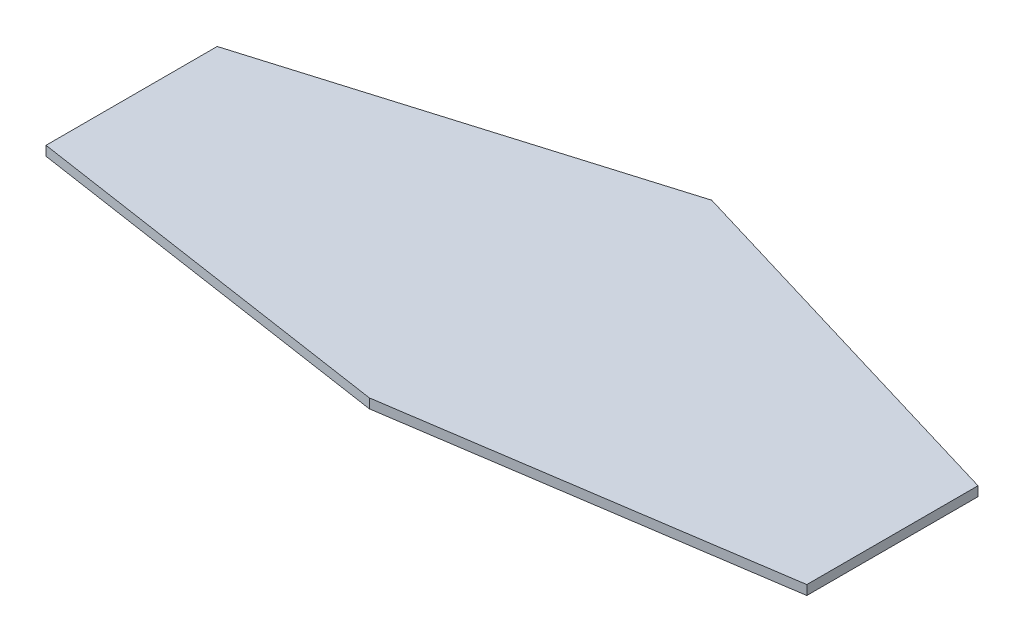
ISO-10303-21;
HEADER;
FILE_DESCRIPTION(('STEP AP214'),'2;1');
FILE_NAME('part.step','',(''),(''),'','','');
FILE_SCHEMA(('AUTOMOTIVE_DESIGN { 1 0 10303 214 1 1 1 1 }'));
ENDSEC;
DATA;
#1=APPLICATION_CONTEXT('core data for automotive mechanical design processes');
#2=APPLICATION_PROTOCOL_DEFINITION('international standard','automotive_design',2000,#1);
#3=PRODUCT_CONTEXT('',#1,'mechanical');
#4=PRODUCT('Part','Part','',(#3));
#5=PRODUCT_RELATED_PRODUCT_CATEGORY('part','',(#4));
#6=PRODUCT_DEFINITION_FORMATION('','',#4);
#7=PRODUCT_DEFINITION_CONTEXT('part definition',#1,'design');
#8=PRODUCT_DEFINITION('design','',#6,#7);
#9=PRODUCT_DEFINITION_SHAPE('','',#8);
#10=(LENGTH_UNIT() NAMED_UNIT(*) SI_UNIT(.MILLI.,.METRE.));
#11=(NAMED_UNIT(*) PLANE_ANGLE_UNIT() SI_UNIT($,.RADIAN.));
#12=(NAMED_UNIT(*) SI_UNIT($,.STERADIAN.) SOLID_ANGLE_UNIT());
#13=UNCERTAINTY_MEASURE_WITH_UNIT(LENGTH_MEASURE(1.E-05),#10,'distance_accuracy_value','');
#14=(GEOMETRIC_REPRESENTATION_CONTEXT(3) GLOBAL_UNCERTAINTY_ASSIGNED_CONTEXT((#13)) GLOBAL_UNIT_ASSIGNED_CONTEXT((#10,
#11,#12)) REPRESENTATION_CONTEXT('',''));
#15=CARTESIAN_POINT('',(0.,0.,0.));
#16=DIRECTION('',(0.,0.,1.));
#17=DIRECTION('',(1.,0.,0.));
#18=AXIS2_PLACEMENT_3D('',#15,#16,#17);
#19=CARTESIAN_POINT('',(200.,5.,-60.));
#20=DIRECTION('',(-0.287347885566345,0.,0.957826285221151));
#21=DIRECTION('',(0.957826285221151,0.,0.287347885566345));
#22=AXIS2_PLACEMENT_3D('',#19,#20,#21);
#23=PLANE('',#22);
#24=DIRECTION('',(-0.957826285221151,0.,-0.287347885566345));
#25=VECTOR('',#24,1.);
#26=CARTESIAN_POINT('',(200.,0.,-60.));
#27=LINE('',#26,#25);
#28=CARTESIAN_POINT('',(200.,0.,-60.));
#29=VERTEX_POINT('',#28);
#30=CARTESIAN_POINT('',(0.,0.,-120.));
#31=VERTEX_POINT('',#30);
#32=EDGE_CURVE('E85',#29,#31,#27,.T.);
#33=ORIENTED_EDGE('',*,*,#32,.T.);
#34=DIRECTION('',(0.,-1.,0.));
#35=VECTOR('',#34,1.);
#36=CARTESIAN_POINT('',(0.,5.,-120.));
#37=LINE('',#36,#35);
#38=CARTESIAN_POINT('',(0.,5.,-120.));
#39=VERTEX_POINT('',#38);
#40=EDGE_CURVE('E11',#39,#31,#37,.T.);
#41=ORIENTED_EDGE('',*,*,#40,.F.);
#42=DIRECTION('',(-0.957826285221151,0.,-0.287347885566345));
#43=VECTOR('',#42,1.);
#44=CARTESIAN_POINT('',(200.,5.,-60.));
#45=LINE('',#44,#43);
#46=CARTESIAN_POINT('',(200.,5.,-60.));
#47=VERTEX_POINT('',#46);
#48=EDGE_CURVE('E108',#47,#39,#45,.T.);
#49=ORIENTED_EDGE('',*,*,#48,.F.);
#50=DIRECTION('',(0.,-1.,0.));
#51=VECTOR('',#50,1.);
#52=CARTESIAN_POINT('',(200.,5.,-60.));
#53=LINE('',#52,#51);
#54=EDGE_CURVE('E98',#47,#29,#53,.T.);
#55=ORIENTED_EDGE('',*,*,#54,.T.);
#56=EDGE_LOOP('',(#33,#41,#49,#55));
#57=FACE_BOUND('',#56,.T.);
#58=ADVANCED_FACE('F29',(#57),#23,.F.);
#59=CARTESIAN_POINT('',(0.,5.,-120.));
#60=DIRECTION('',(0.287347885566345,0.,0.957826285221151));
#61=DIRECTION('',(0.957826285221151,0.,-0.287347885566345));
#62=AXIS2_PLACEMENT_3D('',#59,#60,#61);
#63=PLANE('',#62);
#64=DIRECTION('',(-0.957826285221151,0.,0.287347885566345));
#65=VECTOR('',#64,1.);
#66=CARTESIAN_POINT('',(0.,0.,-120.));
#67=LINE('',#66,#65);
#68=CARTESIAN_POINT('',(-200.,0.,-60.));
#69=VERTEX_POINT('',#68);
#70=EDGE_CURVE('E81',#31,#69,#67,.T.);
#71=ORIENTED_EDGE('',*,*,#70,.T.);
#72=DIRECTION('',(0.,-1.,0.));
#73=VECTOR('',#72,1.);
#74=CARTESIAN_POINT('',(-200.,5.,-60.));
#75=LINE('',#74,#73);
#76=CARTESIAN_POINT('',(-200.,5.,-60.));
#77=VERTEX_POINT('',#76);
#78=EDGE_CURVE('E36',#77,#69,#75,.T.);
#79=ORIENTED_EDGE('',*,*,#78,.F.);
#80=DIRECTION('',(-0.957826285221151,0.,0.287347885566345));
#81=VECTOR('',#80,1.);
#82=CARTESIAN_POINT('',(0.,5.,-120.));
#83=LINE('',#82,#81);
#84=EDGE_CURVE('E94',#39,#77,#83,.T.);
#85=ORIENTED_EDGE('',*,*,#84,.F.);
#86=ORIENTED_EDGE('',*,*,#40,.T.);
#87=EDGE_LOOP('',(#71,#79,#85,#86));
#88=FACE_BOUND('',#87,.T.);
#89=ADVANCED_FACE('F93',(#88),#63,.F.);
#90=CARTESIAN_POINT('',(-200.,5.,-60.));
#91=DIRECTION('',(1.,0.,0.));
#92=DIRECTION('',(0.,0.,-1.));
#93=AXIS2_PLACEMENT_3D('',#90,#91,#92);
#94=PLANE('',#93);
#95=DIRECTION('',(0.,0.,1.));
#96=VECTOR('',#95,1.);
#97=CARTESIAN_POINT('',(-200.,0.,-60.));
#98=LINE('',#97,#96);
#99=CARTESIAN_POINT('',(-200.,0.,30.));
#100=VERTEX_POINT('',#99);
#101=EDGE_CURVE('E87',#69,#100,#98,.T.);
#102=ORIENTED_EDGE('',*,*,#101,.T.);
#103=DIRECTION('',(0.,-1.,0.));
#104=VECTOR('',#103,1.);
#105=CARTESIAN_POINT('',(-200.,5.,30.));
#106=LINE('',#105,#104);
#107=CARTESIAN_POINT('',(-200.,5.,30.));
#108=VERTEX_POINT('',#107);
#109=EDGE_CURVE('E124',#108,#100,#106,.T.);
#110=ORIENTED_EDGE('',*,*,#109,.F.);
#111=DIRECTION('',(0.,0.,1.));
#112=VECTOR('',#111,1.);
#113=CARTESIAN_POINT('',(-200.,5.,-60.));
#114=LINE('',#113,#112);
#115=EDGE_CURVE('E111',#77,#108,#114,.T.);
#116=ORIENTED_EDGE('',*,*,#115,.F.);
#117=ORIENTED_EDGE('',*,*,#78,.T.);
#118=EDGE_LOOP('',(#102,#110,#116,#117));
#119=FACE_BOUND('',#118,.T.);
#120=ADVANCED_FACE('F128',(#119),#94,.F.);
#121=CARTESIAN_POINT('',(-200.,5.,30.));
#122=DIRECTION('',(0.148340452930245,0.,-0.988936352868298));
#123=DIRECTION('',(-0.988936352868298,0.,-0.148340452930245));
#124=AXIS2_PLACEMENT_3D('',#121,#122,#123);
#125=PLANE('',#124);
#126=DIRECTION('',(0.988936352868298,0.,0.148340452930245));
#127=VECTOR('',#126,1.);
#128=CARTESIAN_POINT('',(-200.,0.,30.));
#129=LINE('',#128,#127);
#130=CARTESIAN_POINT('',(0.,0.,60.));
#131=VERTEX_POINT('',#130);
#132=EDGE_CURVE('E102',#100,#131,#129,.T.);
#133=ORIENTED_EDGE('',*,*,#132,.T.);
#134=DIRECTION('',(0.,-1.,0.));
#135=VECTOR('',#134,1.);
#136=CARTESIAN_POINT('',(0.,5.,60.));
#137=LINE('',#136,#135);
#138=CARTESIAN_POINT('',(0.,5.,60.));
#139=VERTEX_POINT('',#138);
#140=EDGE_CURVE('E121',#139,#131,#137,.T.);
#141=ORIENTED_EDGE('',*,*,#140,.F.);
#142=DIRECTION('',(0.988936352868298,0.,0.148340452930245));
#143=VECTOR('',#142,1.);
#144=CARTESIAN_POINT('',(-200.,5.,30.));
#145=LINE('',#144,#143);
#146=EDGE_CURVE('E113',#108,#139,#145,.T.);
#147=ORIENTED_EDGE('',*,*,#146,.F.);
#148=ORIENTED_EDGE('',*,*,#109,.T.);
#149=EDGE_LOOP('',(#133,#141,#147,#148));
#150=FACE_BOUND('',#149,.T.);
#151=ADVANCED_FACE('F134',(#150),#125,.F.);
#152=CARTESIAN_POINT('',(0.,5.,60.));
#153=DIRECTION('',(-0.148340452930245,0.,-0.988936352868298));
#154=DIRECTION('',(-0.988936352868298,0.,0.148340452930245));
#155=AXIS2_PLACEMENT_3D('',#152,#153,#154);
#156=PLANE('',#155);
#157=DIRECTION('',(0.988936352868298,0.,-0.148340452930245));
#158=VECTOR('',#157,1.);
#159=CARTESIAN_POINT('',(0.,0.,60.));
#160=LINE('',#159,#158);
#161=CARTESIAN_POINT('',(200.,0.,30.));
#162=VERTEX_POINT('',#161);
#163=EDGE_CURVE('E104',#131,#162,#160,.T.);
#164=ORIENTED_EDGE('',*,*,#163,.T.);
#165=DIRECTION('',(0.,-1.,0.));
#166=VECTOR('',#165,1.);
#167=CARTESIAN_POINT('',(200.,5.,30.));
#168=LINE('',#167,#166);
#169=CARTESIAN_POINT('',(200.,5.,30.));
#170=VERTEX_POINT('',#169);
#171=EDGE_CURVE('E118',#170,#162,#168,.T.);
#172=ORIENTED_EDGE('',*,*,#171,.F.);
#173=DIRECTION('',(0.988936352868298,0.,-0.148340452930245));
#174=VECTOR('',#173,1.);
#175=CARTESIAN_POINT('',(0.,5.,60.));
#176=LINE('',#175,#174);
#177=EDGE_CURVE('E48',#139,#170,#176,.T.);
#178=ORIENTED_EDGE('',*,*,#177,.F.);
#179=ORIENTED_EDGE('',*,*,#140,.T.);
#180=EDGE_LOOP('',(#164,#172,#178,#179));
#181=FACE_BOUND('',#180,.T.);
#182=ADVANCED_FACE('F137',(#181),#156,.F.);
#183=CARTESIAN_POINT('',(200.,5.,30.));
#184=DIRECTION('',(-1.,0.,0.));
#185=DIRECTION('',(0.,0.,1.));
#186=AXIS2_PLACEMENT_3D('',#183,#184,#185);
#187=PLANE('',#186);
#188=DIRECTION('',(0.,0.,-1.));
#189=VECTOR('',#188,1.);
#190=CARTESIAN_POINT('',(200.,0.,30.));
#191=LINE('',#190,#189);
#192=EDGE_CURVE('E106',#162,#29,#191,.T.);
#193=ORIENTED_EDGE('',*,*,#192,.T.);
#194=ORIENTED_EDGE('',*,*,#54,.F.);
#195=DIRECTION('',(0.,0.,-1.));
#196=VECTOR('',#195,1.);
#197=CARTESIAN_POINT('',(200.,5.,30.));
#198=LINE('',#197,#196);
#199=EDGE_CURVE('E43',#170,#47,#198,.T.);
#200=ORIENTED_EDGE('',*,*,#199,.F.);
#201=ORIENTED_EDGE('',*,*,#171,.T.);
#202=EDGE_LOOP('',(#193,#194,#200,#201));
#203=FACE_BOUND('',#202,.T.);
#204=ADVANCED_FACE('F139',(#203),#187,.F.);
#205=CARTESIAN_POINT('',(-200.,5.,-180.));
#206=DIRECTION('',(0.,1.,0.));
#207=DIRECTION('',(0.,0.,1.));
#208=AXIS2_PLACEMENT_3D('',#205,#206,#207);
#209=PLANE('',#208);
#210=ORIENTED_EDGE('',*,*,#48,.T.);
#211=ORIENTED_EDGE('',*,*,#84,.T.);
#212=ORIENTED_EDGE('',*,*,#115,.T.);
#213=ORIENTED_EDGE('',*,*,#146,.T.);
#214=ORIENTED_EDGE('',*,*,#177,.T.);
#215=ORIENTED_EDGE('',*,*,#199,.T.);
#216=EDGE_LOOP('',(#210,#211,#212,#213,#214,#215));
#217=FACE_BOUND('',#216,.T.);
#218=ADVANCED_FACE('F131',(#217),#209,.T.);
#219=CARTESIAN_POINT('',(-200.,0.,-180.));
#220=DIRECTION('',(0.,1.,0.));
#221=DIRECTION('',(0.,0.,1.));
#222=AXIS2_PLACEMENT_3D('',#219,#220,#221);
#223=PLANE('',#222);
#224=ORIENTED_EDGE('',*,*,#32,.F.);
#225=ORIENTED_EDGE('',*,*,#192,.F.);
#226=ORIENTED_EDGE('',*,*,#163,.F.);
#227=ORIENTED_EDGE('',*,*,#132,.F.);
#228=ORIENTED_EDGE('',*,*,#101,.F.);
#229=ORIENTED_EDGE('',*,*,#70,.F.);
#230=EDGE_LOOP('',(#224,#225,#226,#227,#228,#229));
#231=FACE_BOUND('',#230,.T.);
#232=ADVANCED_FACE('F82',(#231),#223,.F.);
#233=CLOSED_SHELL('',(#58,#89,#120,#151,#182,#204,#218,#232));
#234=MANIFOLD_SOLID_BREP('B2',#233);
#235=ADVANCED_BREP_SHAPE_REPRESENTATION('',(#18,#234),#14);
#236=SHAPE_DEFINITION_REPRESENTATION(#9,#235);
ENDSEC;
END-ISO-10303-21;
